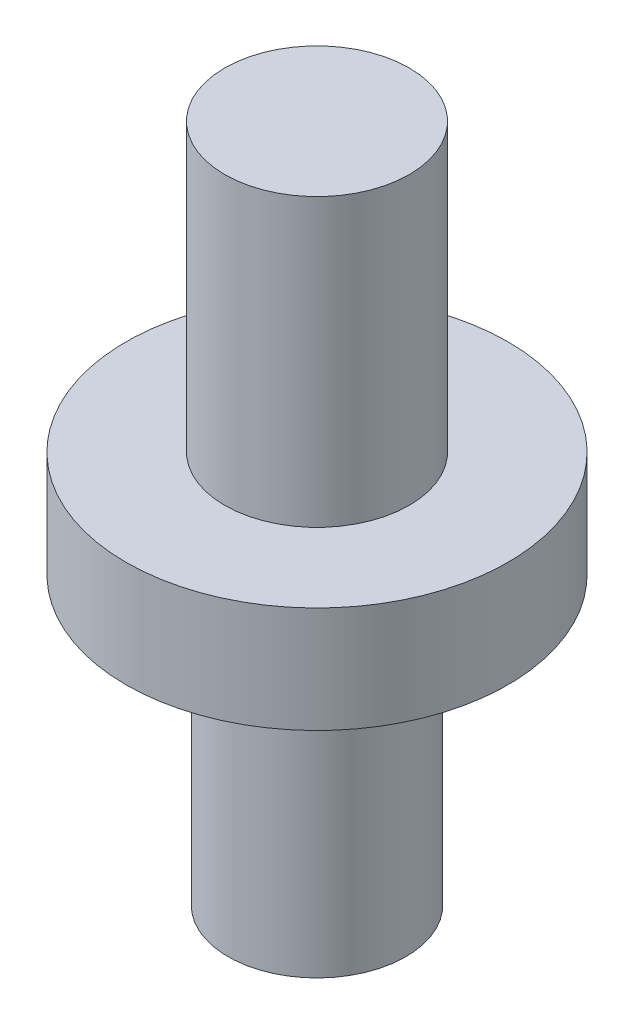
ISO-10303-21;
HEADER;
FILE_DESCRIPTION(('STEP AP214'),'2;1');
FILE_NAME('part.step','',(''),(''),'','','');
FILE_SCHEMA(('AUTOMOTIVE_DESIGN { 1 0 10303 214 1 1 1 1 }'));
ENDSEC;
DATA;
#1=APPLICATION_CONTEXT('core data for automotive mechanical design processes');
#2=APPLICATION_PROTOCOL_DEFINITION('international standard','automotive_design',2000,#1);
#3=PRODUCT_CONTEXT('',#1,'mechanical');
#4=PRODUCT('Part','Part','',(#3));
#5=PRODUCT_RELATED_PRODUCT_CATEGORY('part','',(#4));
#6=PRODUCT_DEFINITION_FORMATION('','',#4);
#7=PRODUCT_DEFINITION_CONTEXT('part definition',#1,'design');
#8=PRODUCT_DEFINITION('design','',#6,#7);
#9=PRODUCT_DEFINITION_SHAPE('','',#8);
#10=(LENGTH_UNIT() NAMED_UNIT(*) SI_UNIT(.MILLI.,.METRE.));
#11=(NAMED_UNIT(*) PLANE_ANGLE_UNIT() SI_UNIT($,.RADIAN.));
#12=(NAMED_UNIT(*) SI_UNIT($,.STERADIAN.) SOLID_ANGLE_UNIT());
#13=UNCERTAINTY_MEASURE_WITH_UNIT(LENGTH_MEASURE(1.E-05),#10,'distance_accuracy_value','');
#14=(GEOMETRIC_REPRESENTATION_CONTEXT(3) GLOBAL_UNCERTAINTY_ASSIGNED_CONTEXT((#13)) GLOBAL_UNIT_ASSIGNED_CONTEXT((#10,
#11,#12)) REPRESENTATION_CONTEXT('',''));
#15=CARTESIAN_POINT('',(0.,0.,0.));
#16=DIRECTION('',(0.,0.,1.));
#17=DIRECTION('',(1.,0.,0.));
#18=AXIS2_PLACEMENT_3D('',#15,#16,#17);
#19=CARTESIAN_POINT('',(0.,8.,0.));
#20=DIRECTION('',(0.,-1.,0.));
#21=DIRECTION('',(0.,0.,-1.));
#22=AXIS2_PLACEMENT_3D('',#19,#20,#21);
#23=CYLINDRICAL_SURFACE('',#22,2.175);
#24=CARTESIAN_POINT('',(0.,8.,0.));
#25=DIRECTION('',(0.,1.,0.));
#26=DIRECTION('',(0.,0.,1.));
#27=AXIS2_PLACEMENT_3D('',#24,#25,#26);
#28=CIRCLE('',#27,2.175);
#29=CARTESIAN_POINT('',(0.,8.,2.175));
#30=VERTEX_POINT('',#29);
#31=EDGE_CURVE('E43',#30,#30,#28,.T.);
#32=ORIENTED_EDGE('',*,*,#31,.F.);
#33=EDGE_LOOP('',(#32));
#34=FACE_BOUND('',#33,.T.);
#35=CARTESIAN_POINT('',(0.,1.25,0.));
#36=DIRECTION('',(0.,-1.,0.));
#37=DIRECTION('',(0.,0.,-1.));
#38=AXIS2_PLACEMENT_3D('',#35,#36,#37);
#39=CIRCLE('',#38,2.175);
#40=CARTESIAN_POINT('',(0.,1.25,-2.175));
#41=VERTEX_POINT('',#40);
#42=EDGE_CURVE('E10',#41,#41,#39,.T.);
#43=ORIENTED_EDGE('',*,*,#42,.F.);
#44=EDGE_LOOP('',(#43));
#45=FACE_BOUND('',#44,.T.);
#46=ADVANCED_FACE('F40',(#34,#45),#23,.T.);
#47=CARTESIAN_POINT('',(0.,8.,0.));
#48=DIRECTION('',(0.,1.,0.));
#49=DIRECTION('',(0.,0.,1.));
#50=AXIS2_PLACEMENT_3D('',#47,#48,#49);
#51=PLANE('',#50);
#52=ORIENTED_EDGE('',*,*,#31,.T.);
#53=EDGE_LOOP('',(#52));
#54=FACE_BOUND('',#53,.T.);
#55=ADVANCED_FACE('F88',(#54),#51,.T.);
#56=CARTESIAN_POINT('',(0.,-1.25,0.));
#57=DIRECTION('',(0.,1.,0.));
#58=DIRECTION('',(0.,0.,1.));
#59=AXIS2_PLACEMENT_3D('',#56,#57,#58);
#60=CYLINDRICAL_SURFACE('',#59,4.5);
#61=CARTESIAN_POINT('',(0.,-1.25,0.));
#62=DIRECTION('',(0.,-1.,0.));
#63=DIRECTION('',(0.,0.,-1.));
#64=AXIS2_PLACEMENT_3D('',#61,#62,#63);
#65=CIRCLE('',#64,4.5);
#66=CARTESIAN_POINT('',(0.,-1.25,-4.5));
#67=VERTEX_POINT('',#66);
#68=EDGE_CURVE('E57',#67,#67,#65,.T.);
#69=ORIENTED_EDGE('',*,*,#68,.F.);
#70=EDGE_LOOP('',(#69));
#71=FACE_BOUND('',#70,.T.);
#72=CARTESIAN_POINT('',(0.,1.25,0.));
#73=DIRECTION('',(0.,-1.,0.));
#74=DIRECTION('',(0.,0.,-1.));
#75=AXIS2_PLACEMENT_3D('',#72,#73,#74);
#76=CIRCLE('',#75,4.5);
#77=CARTESIAN_POINT('',(0.,1.25,-4.5));
#78=VERTEX_POINT('',#77);
#79=EDGE_CURVE('E58',#78,#78,#76,.T.);
#80=ORIENTED_EDGE('',*,*,#79,.T.);
#81=EDGE_LOOP('',(#80));
#82=FACE_BOUND('',#81,.T.);
#83=ADVANCED_FACE('F70',(#71,#82),#60,.T.);
#84=CARTESIAN_POINT('',(0.,-1.25,0.));
#85=DIRECTION('',(0.,-1.,0.));
#86=DIRECTION('',(0.,0.,-1.));
#87=AXIS2_PLACEMENT_3D('',#84,#85,#86);
#88=PLANE('',#87);
#89=CARTESIAN_POINT('',(0.,-1.25,0.));
#90=DIRECTION('',(0.,-1.,0.));
#91=DIRECTION('',(0.,0.,-1.));
#92=AXIS2_PLACEMENT_3D('',#89,#90,#91);
#93=CIRCLE('',#92,2.095);
#94=CARTESIAN_POINT('',(0.,-1.25,-2.095));
#95=VERTEX_POINT('',#94);
#96=EDGE_CURVE('E55',#95,#95,#93,.T.);
#97=ORIENTED_EDGE('',*,*,#96,.F.);
#98=EDGE_LOOP('',(#97));
#99=FACE_BOUND('',#98,.T.);
#100=ORIENTED_EDGE('',*,*,#68,.T.);
#101=EDGE_LOOP('',(#100));
#102=FACE_BOUND('',#101,.T.);
#103=ADVANCED_FACE('F75',(#99,#102),#88,.T.);
#104=CARTESIAN_POINT('',(0.,1.25,0.));
#105=DIRECTION('',(0.,-1.,0.));
#106=DIRECTION('',(0.,0.,-1.));
#107=AXIS2_PLACEMENT_3D('',#104,#105,#106);
#108=PLANE('',#107);
#109=ORIENTED_EDGE('',*,*,#42,.T.);
#110=EDGE_LOOP('',(#109));
#111=FACE_BOUND('',#110,.T.);
#112=ORIENTED_EDGE('',*,*,#79,.F.);
#113=EDGE_LOOP('',(#112));
#114=FACE_BOUND('',#113,.T.);
#115=ADVANCED_FACE('F69',(#111,#114),#108,.F.);
#116=CARTESIAN_POINT('',(0.,-8.,0.));
#117=DIRECTION('',(0.,-1.,0.));
#118=DIRECTION('',(0.,0.,-1.));
#119=AXIS2_PLACEMENT_3D('',#116,#117,#118);
#120=PLANE('',#119);
#121=CARTESIAN_POINT('',(0.,-8.,0.));
#122=DIRECTION('',(0.,-1.,0.));
#123=DIRECTION('',(0.,0.,-1.));
#124=AXIS2_PLACEMENT_3D('',#121,#122,#123);
#125=CIRCLE('',#124,2.095);
#126=CARTESIAN_POINT('',(0.,-8.,-2.095));
#127=VERTEX_POINT('',#126);
#128=EDGE_CURVE('E50',#127,#127,#125,.T.);
#129=ORIENTED_EDGE('',*,*,#128,.T.);
#130=EDGE_LOOP('',(#129));
#131=FACE_BOUND('',#130,.T.);
#132=ADVANCED_FACE('F72',(#131),#120,.T.);
#133=CARTESIAN_POINT('',(0.,-8.,0.));
#134=DIRECTION('',(0.,1.,0.));
#135=DIRECTION('',(0.,0.,1.));
#136=AXIS2_PLACEMENT_3D('',#133,#134,#135);
#137=CYLINDRICAL_SURFACE('',#136,2.095);
#138=ORIENTED_EDGE('',*,*,#96,.T.);
#139=EDGE_LOOP('',(#138));
#140=FACE_BOUND('',#139,.T.);
#141=ORIENTED_EDGE('',*,*,#128,.F.);
#142=EDGE_LOOP('',(#141));
#143=FACE_BOUND('',#142,.T.);
#144=ADVANCED_FACE('F78',(#140,#143),#137,.T.);
#145=CLOSED_SHELL('',(#46,#55,#83,#103,#115,#132,#144));
#146=MANIFOLD_SOLID_BREP('B2',#145);
#147=ADVANCED_BREP_SHAPE_REPRESENTATION('',(#18,#146),#14);
#148=SHAPE_DEFINITION_REPRESENTATION(#9,#147);
ENDSEC;
END-ISO-10303-21;
